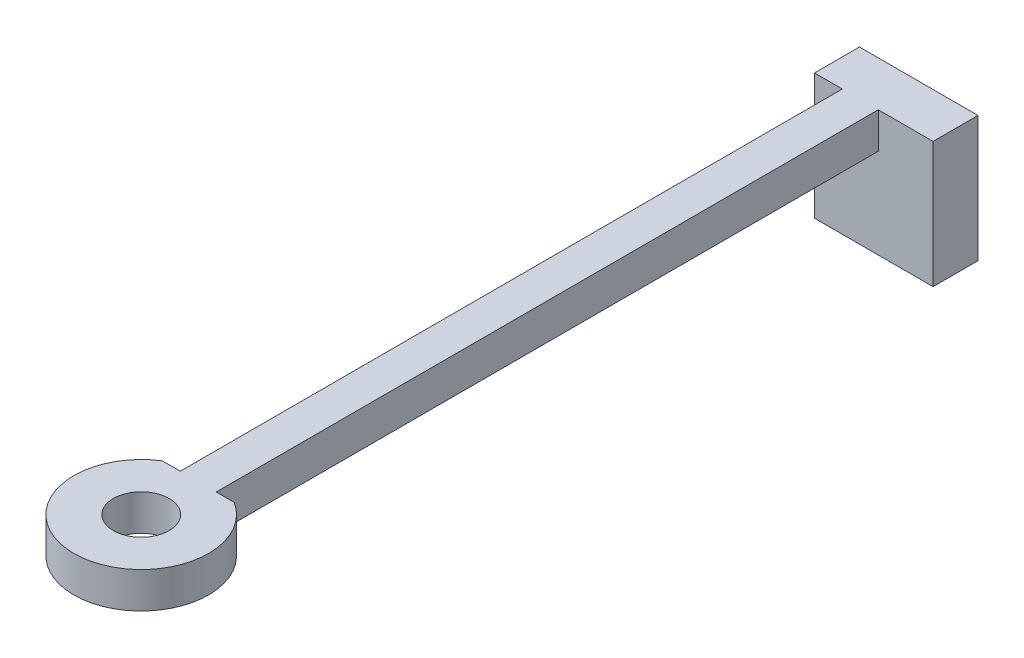
ISO-10303-21;
HEADER;
FILE_DESCRIPTION(('STEP AP214'),'2;1');
FILE_NAME('part.step','',(''),(''),'','','');
FILE_SCHEMA(('AUTOMOTIVE_DESIGN { 1 0 10303 214 1 1 1 1 }'));
ENDSEC;
DATA;
#1=APPLICATION_CONTEXT('core data for automotive mechanical design processes');
#2=APPLICATION_PROTOCOL_DEFINITION('international standard','automotive_design',2000,#1);
#3=PRODUCT_CONTEXT('',#1,'mechanical');
#4=PRODUCT('Part','Part','',(#3));
#5=PRODUCT_RELATED_PRODUCT_CATEGORY('part','',(#4));
#6=PRODUCT_DEFINITION_FORMATION('','',#4);
#7=PRODUCT_DEFINITION_CONTEXT('part definition',#1,'design');
#8=PRODUCT_DEFINITION('design','',#6,#7);
#9=PRODUCT_DEFINITION_SHAPE('','',#8);
#10=(LENGTH_UNIT() NAMED_UNIT(*) SI_UNIT(.MILLI.,.METRE.));
#11=(NAMED_UNIT(*) PLANE_ANGLE_UNIT() SI_UNIT($,.RADIAN.));
#12=(NAMED_UNIT(*) SI_UNIT($,.STERADIAN.) SOLID_ANGLE_UNIT());
#13=UNCERTAINTY_MEASURE_WITH_UNIT(LENGTH_MEASURE(1.E-05),#10,'distance_accuracy_value','');
#14=(GEOMETRIC_REPRESENTATION_CONTEXT(3) GLOBAL_UNCERTAINTY_ASSIGNED_CONTEXT((#13)) GLOBAL_UNIT_ASSIGNED_CONTEXT((#10,
#11,#12)) REPRESENTATION_CONTEXT('',''));
#15=CARTESIAN_POINT('',(0.,0.,0.));
#16=DIRECTION('',(0.,0.,1.));
#17=DIRECTION('',(1.,0.,0.));
#18=AXIS2_PLACEMENT_3D('',#15,#16,#17);
#19=CARTESIAN_POINT('',(0.,4.,0.));
#20=DIRECTION('',(0.,1.,0.));
#21=DIRECTION('',(0.,0.,1.));
#22=AXIS2_PLACEMENT_3D('',#19,#20,#21);
#23=PLANE('',#22);
#24=DIRECTION('',(0.,0.,1.));
#25=VECTOR('',#24,1.);
#26=CARTESIAN_POINT('',(1.99999999999998,4.,33.6557112297753));
#27=LINE('',#26,#25);
#28=CARTESIAN_POINT('',(1.99999999999998,4.,-39.9999999999999));
#29=VERTEX_POINT('',#28);
#30=CARTESIAN_POINT('',(1.99999999999998,4.,33.6557112297753));
#31=VERTEX_POINT('',#30);
#32=EDGE_CURVE('E183',#29,#31,#27,.T.);
#33=ORIENTED_EDGE('',*,*,#32,.F.);
#34=DIRECTION('',(-1.,0.,0.));
#35=VECTOR('',#34,1.);
#36=CARTESIAN_POINT('',(-5.0954148248011,4.,-40.));
#37=LINE('',#36,#35);
#38=CARTESIAN_POINT('',(8.09541482480107,4.,-40.));
#39=VERTEX_POINT('',#38);
#40=EDGE_CURVE('E155',#39,#29,#37,.T.);
#41=ORIENTED_EDGE('',*,*,#40,.F.);
#42=DIRECTION('',(0.,0.,1.));
#43=VECTOR('',#42,1.);
#44=CARTESIAN_POINT('',(8.09541482480107,4.,-40.));
#45=LINE('',#44,#43);
#46=CARTESIAN_POINT('',(8.09541482480107,4.,-45.));
#47=VERTEX_POINT('',#46);
#48=EDGE_CURVE('E131',#47,#39,#45,.T.);
#49=ORIENTED_EDGE('',*,*,#48,.F.);
#50=DIRECTION('',(-1.,0.,0.));
#51=VECTOR('',#50,1.);
#52=CARTESIAN_POINT('',(3.99999999999998,4.,-45.));
#53=LINE('',#52,#51);
#54=CARTESIAN_POINT('',(-5.0954148248011,4.,-45.));
#55=VERTEX_POINT('',#54);
#56=EDGE_CURVE('E213',#47,#55,#53,.T.);
#57=ORIENTED_EDGE('',*,*,#56,.T.);
#58=DIRECTION('',(0.,0.,-1.));
#59=VECTOR('',#58,1.);
#60=CARTESIAN_POINT('',(-5.0954148248011,4.,-40.));
#61=LINE('',#60,#59);
#62=CARTESIAN_POINT('',(-5.0954148248011,4.,-40.));
#63=VERTEX_POINT('',#62);
#64=EDGE_CURVE('E159',#63,#55,#61,.T.);
#65=ORIENTED_EDGE('',*,*,#64,.F.);
#66=CARTESIAN_POINT('',(-2.00000000000002,4.,-39.9999999999999));
#67=VERTEX_POINT('',#66);
#68=EDGE_CURVE('E154',#67,#63,#37,.T.);
#69=ORIENTED_EDGE('',*,*,#68,.F.);
#70=DIRECTION('',(0.,0.,-1.));
#71=VECTOR('',#70,1.);
#72=CARTESIAN_POINT('',(-2.00000000000002,4.,33.6557112297753));
#73=LINE('',#72,#71);
#74=CARTESIAN_POINT('',(-2.00000000000002,4.,33.6557112297753));
#75=VERTEX_POINT('',#74);
#76=EDGE_CURVE('E55',#75,#67,#73,.T.);
#77=ORIENTED_EDGE('',*,*,#76,.F.);
#78=DIRECTION('',(1.,0.,0.));
#79=VECTOR('',#78,1.);
#80=CARTESIAN_POINT('',(-4.00000000000002,4.,33.6557112297753));
#81=LINE('',#80,#79);
#82=CARTESIAN_POINT('',(-4.00000000000002,4.,33.6557112297753));
#83=VERTEX_POINT('',#82);
#84=EDGE_CURVE('E190',#83,#75,#81,.T.);
#85=ORIENTED_EDGE('',*,*,#84,.F.);
#86=CARTESIAN_POINT('',(0.,4.,40.));
#87=DIRECTION('',(0.,1.,0.));
#88=DIRECTION('',(0.,0.,1.));
#89=AXIS2_PLACEMENT_3D('',#86,#87,#88);
#90=CIRCLE('',#89,7.5);
#91=CARTESIAN_POINT('',(4.00000000000003,4.,33.6557112297753));
#92=VERTEX_POINT('',#91);
#93=EDGE_CURVE('E201',#83,#92,#90,.T.);
#94=ORIENTED_EDGE('',*,*,#93,.T.);
#95=DIRECTION('',(1.,0.,0.));
#96=VECTOR('',#95,1.);
#97=CARTESIAN_POINT('',(1.99999999999998,4.,33.6557112297753));
#98=LINE('',#97,#96);
#99=EDGE_CURVE('E178',#31,#92,#98,.T.);
#100=ORIENTED_EDGE('',*,*,#99,.F.);
#101=EDGE_LOOP('',(#33,#41,#49,#57,#65,#69,#77,#85,#94,#100));
#102=FACE_BOUND('',#101,.T.);
#103=CARTESIAN_POINT('',(0.,4.,40.));
#104=DIRECTION('',(0.,1.,0.));
#105=DIRECTION('',(0.,0.,1.));
#106=AXIS2_PLACEMENT_3D('',#103,#104,#105);
#107=CIRCLE('',#106,3.1);
#108=CARTESIAN_POINT('',(0.,4.,43.1));
#109=VERTEX_POINT('',#108);
#110=EDGE_CURVE('E210',#109,#109,#107,.T.);
#111=ORIENTED_EDGE('',*,*,#110,.F.);
#112=EDGE_LOOP('',(#111));
#113=FACE_BOUND('',#112,.T.);
#114=ADVANCED_FACE('F35',(#102,#113),#23,.T.);
#115=CARTESIAN_POINT('',(0.,0.,0.));
#116=DIRECTION('',(0.,1.,0.));
#117=DIRECTION('',(0.,0.,1.));
#118=AXIS2_PLACEMENT_3D('',#115,#116,#117);
#119=PLANE('',#118);
#120=DIRECTION('',(0.,0.,-1.));
#121=VECTOR('',#120,1.);
#122=CARTESIAN_POINT('',(-2.00000000000002,0.,33.6557112297753));
#123=LINE('',#122,#121);
#124=CARTESIAN_POINT('',(-2.00000000000002,0.,33.6557112297753));
#125=VERTEX_POINT('',#124);
#126=CARTESIAN_POINT('',(-2.00000000000002,0.,-39.9999999999999));
#127=VERTEX_POINT('',#126);
#128=EDGE_CURVE('E194',#125,#127,#123,.T.);
#129=ORIENTED_EDGE('',*,*,#128,.T.);
#130=DIRECTION('',(1.,0.,0.));
#131=VECTOR('',#130,1.);
#132=CARTESIAN_POINT('',(0.,0.,-40.));
#133=LINE('',#132,#131);
#134=CARTESIAN_POINT('',(-0.999999999999994,0.,-40.));
#135=VERTEX_POINT('',#134);
#136=EDGE_CURVE('E167',#127,#135,#133,.T.);
#137=ORIENTED_EDGE('',*,*,#136,.T.);
#138=DIRECTION('',(0.,0.,1.));
#139=VECTOR('',#138,1.);
#140=CARTESIAN_POINT('',(-0.999999999999986,0.,40.));
#141=LINE('',#140,#139);
#142=CARTESIAN_POINT('',(-0.99999999999999,0.,33.6557112297753));
#143=VERTEX_POINT('',#142);
#144=EDGE_CURVE('E176',#135,#143,#141,.T.);
#145=ORIENTED_EDGE('',*,*,#144,.T.);
#146=DIRECTION('',(1.,0.,0.));
#147=VECTOR('',#146,1.);
#148=CARTESIAN_POINT('',(0.,0.,33.6557112297753));
#149=LINE('',#148,#147);
#150=CARTESIAN_POINT('',(1.00000000000001,0.,33.6557112297753));
#151=VERTEX_POINT('',#150);
#152=EDGE_CURVE('E43',#143,#151,#149,.T.);
#153=ORIENTED_EDGE('',*,*,#152,.T.);
#154=DIRECTION('',(0.,0.,1.));
#155=VECTOR('',#154,1.);
#156=CARTESIAN_POINT('',(1.,0.,40.));
#157=LINE('',#156,#155);
#158=CARTESIAN_POINT('',(0.999999999999995,0.,-40.));
#159=VERTEX_POINT('',#158);
#160=EDGE_CURVE('E173',#151,#159,#157,.F.);
#161=ORIENTED_EDGE('',*,*,#160,.T.);
#162=CARTESIAN_POINT('',(1.99999999999998,0.,-39.9999999999999));
#163=VERTEX_POINT('',#162);
#164=EDGE_CURVE('E134',#159,#163,#133,.T.);
#165=ORIENTED_EDGE('',*,*,#164,.T.);
#166=DIRECTION('',(0.,0.,1.));
#167=VECTOR('',#166,1.);
#168=CARTESIAN_POINT('',(1.99999999999998,0.,33.6557112297753));
#169=LINE('',#168,#167);
#170=CARTESIAN_POINT('',(1.99999999999998,0.,33.6557112297753));
#171=VERTEX_POINT('',#170);
#172=EDGE_CURVE('E182',#163,#171,#169,.T.);
#173=ORIENTED_EDGE('',*,*,#172,.T.);
#174=DIRECTION('',(1.,0.,0.));
#175=VECTOR('',#174,1.);
#176=CARTESIAN_POINT('',(1.99999999999998,0.,33.6557112297753));
#177=LINE('',#176,#175);
#178=CARTESIAN_POINT('',(4.00000000000003,0.,33.6557112297753));
#179=VERTEX_POINT('',#178);
#180=EDGE_CURVE('E179',#171,#179,#177,.T.);
#181=ORIENTED_EDGE('',*,*,#180,.T.);
#182=CARTESIAN_POINT('',(0.,0.,40.));
#183=DIRECTION('',(0.,1.,0.));
#184=DIRECTION('',(0.,0.,1.));
#185=AXIS2_PLACEMENT_3D('',#182,#183,#184);
#186=CIRCLE('',#185,7.5);
#187=CARTESIAN_POINT('',(-4.00000000000002,0.,33.6557112297753));
#188=VERTEX_POINT('',#187);
#189=EDGE_CURVE('E202',#179,#188,#186,.F.);
#190=ORIENTED_EDGE('',*,*,#189,.T.);
#191=DIRECTION('',(1.,0.,0.));
#192=VECTOR('',#191,1.);
#193=CARTESIAN_POINT('',(-4.00000000000002,0.,33.6557112297753));
#194=LINE('',#193,#192);
#195=EDGE_CURVE('E191',#188,#125,#194,.T.);
#196=ORIENTED_EDGE('',*,*,#195,.T.);
#197=EDGE_LOOP('',(#129,#137,#145,#153,#161,#165,#173,#181,#190,#196));
#198=FACE_BOUND('',#197,.T.);
#199=CARTESIAN_POINT('',(0.,0.,40.));
#200=DIRECTION('',(0.,1.,0.));
#201=DIRECTION('',(0.,0.,1.));
#202=AXIS2_PLACEMENT_3D('',#199,#200,#201);
#203=CIRCLE('',#202,3.1);
#204=CARTESIAN_POINT('',(0.,0.,43.1));
#205=VERTEX_POINT('',#204);
#206=EDGE_CURVE('E209',#205,#205,#203,.T.);
#207=ORIENTED_EDGE('',*,*,#206,.T.);
#208=EDGE_LOOP('',(#207));
#209=FACE_BOUND('',#208,.T.);
#210=ADVANCED_FACE('F221',(#198,#209),#119,.F.);
#211=CARTESIAN_POINT('',(3.99999999999998,4.,-45.));
#212=DIRECTION('',(0.,0.,1.));
#213=DIRECTION('',(1.,0.,0.));
#214=AXIS2_PLACEMENT_3D('',#211,#212,#213);
#215=PLANE('',#214);
#216=DIRECTION('',(0.,-1.,0.));
#217=VECTOR('',#216,1.);
#218=CARTESIAN_POINT('',(-5.0954148248011,18.1066646250921,-45.));
#219=LINE('',#218,#217);
#220=CARTESIAN_POINT('',(-5.0954148248011,-10.,-45.));
#221=VERTEX_POINT('',#220);
#222=EDGE_CURVE('E162',#55,#221,#219,.T.);
#223=ORIENTED_EDGE('',*,*,#222,.F.);
#224=ORIENTED_EDGE('',*,*,#56,.F.);
#225=DIRECTION('',(0.,-1.,0.));
#226=VECTOR('',#225,1.);
#227=CARTESIAN_POINT('',(8.09541482480107,18.1066646250921,-45.));
#228=LINE('',#227,#226);
#229=CARTESIAN_POINT('',(8.09541482480107,-10.,-45.));
#230=VERTEX_POINT('',#229);
#231=EDGE_CURVE('E158',#47,#230,#228,.T.);
#232=ORIENTED_EDGE('',*,*,#231,.T.);
#233=DIRECTION('',(1.,0.,0.));
#234=VECTOR('',#233,1.);
#235=CARTESIAN_POINT('',(-5.0954148248011,-10.,-45.));
#236=LINE('',#235,#234);
#237=EDGE_CURVE('E149',#221,#230,#236,.T.);
#238=ORIENTED_EDGE('',*,*,#237,.F.);
#239=EDGE_LOOP('',(#223,#224,#232,#238));
#240=FACE_BOUND('',#239,.T.);
#241=ADVANCED_FACE('F37',(#240),#215,.F.);
#242=CARTESIAN_POINT('',(0.,4.,40.));
#243=DIRECTION('',(0.,-1.,0.));
#244=DIRECTION('',(0.,0.,-1.));
#245=AXIS2_PLACEMENT_3D('',#242,#243,#244);
#246=CYLINDRICAL_SURFACE('',#245,3.1);
#247=ORIENTED_EDGE('',*,*,#110,.T.);
#248=EDGE_LOOP('',(#247));
#249=FACE_BOUND('',#248,.T.);
#250=ORIENTED_EDGE('',*,*,#206,.F.);
#251=EDGE_LOOP('',(#250));
#252=FACE_BOUND('',#251,.T.);
#253=ADVANCED_FACE('F260',(#249,#252),#246,.F.);
#254=CARTESIAN_POINT('',(0.,-21.2132034355964,40.));
#255=DIRECTION('',(0.,1.,0.));
#256=DIRECTION('',(0.,0.,1.));
#257=AXIS2_PLACEMENT_3D('',#254,#255,#256);
#258=CYLINDRICAL_SURFACE('',#257,7.5);
#259=DIRECTION('',(0.,1.,0.));
#260=VECTOR('',#259,1.);
#261=CARTESIAN_POINT('',(-4.00000000000002,-21.2132034355964,33.6557112297753));
#262=LINE('',#261,#260);
#263=EDGE_CURVE('E205',#188,#83,#262,.T.);
#264=ORIENTED_EDGE('',*,*,#263,.F.);
#265=ORIENTED_EDGE('',*,*,#189,.F.);
#266=DIRECTION('',(0.,1.,0.));
#267=VECTOR('',#266,1.);
#268=CARTESIAN_POINT('',(4.00000000000003,-21.2132034355964,33.6557112297753));
#269=LINE('',#268,#267);
#270=EDGE_CURVE('E217',#92,#179,#269,.F.);
#271=ORIENTED_EDGE('',*,*,#270,.F.);
#272=ORIENTED_EDGE('',*,*,#93,.F.);
#273=EDGE_LOOP('',(#264,#265,#271,#272));
#274=FACE_BOUND('',#273,.T.);
#275=ADVANCED_FACE('F246',(#274),#258,.T.);
#276=CARTESIAN_POINT('',(-2.00000000000002,0.,33.6557112297753));
#277=DIRECTION('',(1.,0.,0.));
#278=DIRECTION('',(0.,0.,-1.));
#279=AXIS2_PLACEMENT_3D('',#276,#277,#278);
#280=PLANE('',#279);
#281=ORIENTED_EDGE('',*,*,#76,.T.);
#282=DIRECTION('',(0.,-1.,0.));
#283=VECTOR('',#282,1.);
#284=CARTESIAN_POINT('',(-2.00000000000002,0.,-40.));
#285=LINE('',#284,#283);
#286=EDGE_CURVE('E50',#67,#127,#285,.T.);
#287=ORIENTED_EDGE('',*,*,#286,.T.);
#288=ORIENTED_EDGE('',*,*,#128,.F.);
#289=DIRECTION('',(0.,1.,0.));
#290=VECTOR('',#289,1.);
#291=CARTESIAN_POINT('',(-2.00000000000002,0.,33.6557112297753));
#292=LINE('',#291,#290);
#293=EDGE_CURVE('E196',#125,#75,#292,.T.);
#294=ORIENTED_EDGE('',*,*,#293,.T.);
#295=EDGE_LOOP('',(#281,#287,#288,#294));
#296=FACE_BOUND('',#295,.T.);
#297=ADVANCED_FACE('F274',(#296),#280,.F.);
#298=CARTESIAN_POINT('',(-4.00000000000002,0.,33.6557112297753));
#299=DIRECTION('',(0.,0.,1.));
#300=DIRECTION('',(1.,0.,0.));
#301=AXIS2_PLACEMENT_3D('',#298,#299,#300);
#302=PLANE('',#301);
#303=ORIENTED_EDGE('',*,*,#84,.T.);
#304=ORIENTED_EDGE('',*,*,#293,.F.);
#305=ORIENTED_EDGE('',*,*,#195,.F.);
#306=ORIENTED_EDGE('',*,*,#263,.T.);
#307=EDGE_LOOP('',(#303,#304,#305,#306));
#308=FACE_BOUND('',#307,.T.);
#309=ADVANCED_FACE('F250',(#308),#302,.F.);
#310=CARTESIAN_POINT('',(1.99999999999998,0.,33.6557112297753));
#311=DIRECTION('',(0.,0.,1.));
#312=DIRECTION('',(1.,0.,0.));
#313=AXIS2_PLACEMENT_3D('',#310,#311,#312);
#314=PLANE('',#313);
#315=ORIENTED_EDGE('',*,*,#99,.T.);
#316=ORIENTED_EDGE('',*,*,#270,.T.);
#317=ORIENTED_EDGE('',*,*,#180,.F.);
#318=DIRECTION('',(0.,1.,0.));
#319=VECTOR('',#318,1.);
#320=CARTESIAN_POINT('',(1.99999999999998,0.,33.6557112297753));
#321=LINE('',#320,#319);
#322=EDGE_CURVE('E185',#171,#31,#321,.T.);
#323=ORIENTED_EDGE('',*,*,#322,.T.);
#324=EDGE_LOOP('',(#315,#316,#317,#323));
#325=FACE_BOUND('',#324,.T.);
#326=ADVANCED_FACE('F241',(#325),#314,.F.);
#327=CARTESIAN_POINT('',(1.99999999999998,0.,33.6557112297753));
#328=DIRECTION('',(-1.,0.,0.));
#329=DIRECTION('',(0.,0.,1.));
#330=AXIS2_PLACEMENT_3D('',#327,#328,#329);
#331=PLANE('',#330);
#332=ORIENTED_EDGE('',*,*,#172,.F.);
#333=DIRECTION('',(0.,1.,0.));
#334=VECTOR('',#333,1.);
#335=CARTESIAN_POINT('',(1.99999999999998,0.,-40.));
#336=LINE('',#335,#334);
#337=EDGE_CURVE('E168',#163,#29,#336,.T.);
#338=ORIENTED_EDGE('',*,*,#337,.T.);
#339=ORIENTED_EDGE('',*,*,#32,.T.);
#340=ORIENTED_EDGE('',*,*,#322,.F.);
#341=EDGE_LOOP('',(#332,#338,#339,#340));
#342=FACE_BOUND('',#341,.T.);
#343=ADVANCED_FACE('F236',(#342),#331,.F.);
#344=CARTESIAN_POINT('',(-0.99999999999999,0.,33.6557112297753));
#345=DIRECTION('',(0.,0.,1.));
#346=DIRECTION('',(1.,0.,0.));
#347=AXIS2_PLACEMENT_3D('',#344,#345,#346);
#348=PLANE('',#347);
#349=ORIENTED_EDGE('',*,*,#152,.F.);
#350=CARTESIAN_POINT('',(0.,0.,33.6557112297753));
#351=DIRECTION('',(0.,0.,1.));
#352=DIRECTION('',(1.,0.,0.));
#353=AXIS2_PLACEMENT_3D('',#350,#351,#352);
#354=CIRCLE('',#353,0.999999999999999);
#355=EDGE_CURVE('E171',#143,#151,#354,.T.);
#356=ORIENTED_EDGE('',*,*,#355,.T.);
#357=EDGE_LOOP('',(#349,#356));
#358=FACE_BOUND('',#357,.T.);
#359=ADVANCED_FACE('F228',(#358),#348,.T.);
#360=CARTESIAN_POINT('',(0.,0.,40.));
#361=DIRECTION('',(0.,0.,1.));
#362=DIRECTION('',(1.,0.,0.));
#363=AXIS2_PLACEMENT_3D('',#360,#361,#362);
#364=CYLINDRICAL_SURFACE('',#363,0.999999999999995);
#365=CARTESIAN_POINT('',(0.,0.,-40.));
#366=DIRECTION('',(0.,0.,1.));
#367=DIRECTION('',(1.,0.,0.));
#368=AXIS2_PLACEMENT_3D('',#365,#366,#367);
#369=CIRCLE('',#368,0.999999999999995);
#370=EDGE_CURVE('E11',#159,#135,#369,.F.);
#371=ORIENTED_EDGE('',*,*,#370,.F.);
#372=ORIENTED_EDGE('',*,*,#160,.F.);
#373=ORIENTED_EDGE('',*,*,#355,.F.);
#374=ORIENTED_EDGE('',*,*,#144,.F.);
#375=EDGE_LOOP('',(#371,#372,#373,#374));
#376=FACE_BOUND('',#375,.T.);
#377=ADVANCED_FACE('F230',(#376),#364,.T.);
#378=CARTESIAN_POINT('',(-5.0954148248011,18.1066646250921,-40.));
#379=DIRECTION('',(0.,0.,1.));
#380=DIRECTION('',(1.,0.,0.));
#381=AXIS2_PLACEMENT_3D('',#378,#379,#380);
#382=PLANE('',#381);
#383=ORIENTED_EDGE('',*,*,#286,.F.);
#384=ORIENTED_EDGE('',*,*,#68,.T.);
#385=DIRECTION('',(0.,-1.,0.));
#386=VECTOR('',#385,1.);
#387=CARTESIAN_POINT('',(-5.0954148248011,18.1066646250921,-40.));
#388=LINE('',#387,#386);
#389=CARTESIAN_POINT('',(-5.0954148248011,-10.,-40.));
#390=VERTEX_POINT('',#389);
#391=EDGE_CURVE('E140',#63,#390,#388,.T.);
#392=ORIENTED_EDGE('',*,*,#391,.T.);
#393=DIRECTION('',(-1.,0.,0.));
#394=VECTOR('',#393,1.);
#395=CARTESIAN_POINT('',(-5.0954148248011,-10.,-40.));
#396=LINE('',#395,#394);
#397=CARTESIAN_POINT('',(8.09541482480107,-10.,-40.));
#398=VERTEX_POINT('',#397);
#399=EDGE_CURVE('E137',#398,#390,#396,.T.);
#400=ORIENTED_EDGE('',*,*,#399,.F.);
#401=DIRECTION('',(0.,-1.,0.));
#402=VECTOR('',#401,1.);
#403=CARTESIAN_POINT('',(8.09541482480107,18.1066646250921,-40.));
#404=LINE('',#403,#402);
#405=EDGE_CURVE('E124',#39,#398,#404,.T.);
#406=ORIENTED_EDGE('',*,*,#405,.F.);
#407=ORIENTED_EDGE('',*,*,#40,.T.);
#408=ORIENTED_EDGE('',*,*,#337,.F.);
#409=ORIENTED_EDGE('',*,*,#164,.F.);
#410=ORIENTED_EDGE('',*,*,#370,.T.);
#411=ORIENTED_EDGE('',*,*,#136,.F.);
#412=EDGE_LOOP('',(#383,#384,#392,#400,#406,#407,#408,#409,#410,#411));
#413=FACE_BOUND('',#412,.T.);
#414=ADVANCED_FACE('F138',(#413),#382,.T.);
#415=CARTESIAN_POINT('',(-5.0954148248011,18.1066646250921,-40.));
#416=DIRECTION('',(-1.,0.,0.));
#417=DIRECTION('',(0.,0.,1.));
#418=AXIS2_PLACEMENT_3D('',#415,#416,#417);
#419=PLANE('',#418);
#420=ORIENTED_EDGE('',*,*,#391,.F.);
#421=ORIENTED_EDGE('',*,*,#64,.T.);
#422=ORIENTED_EDGE('',*,*,#222,.T.);
#423=DIRECTION('',(0.,0.,-1.));
#424=VECTOR('',#423,1.);
#425=CARTESIAN_POINT('',(-5.0954148248011,-10.,-40.));
#426=LINE('',#425,#424);
#427=EDGE_CURVE('E144',#390,#221,#426,.T.);
#428=ORIENTED_EDGE('',*,*,#427,.F.);
#429=EDGE_LOOP('',(#420,#421,#422,#428));
#430=FACE_BOUND('',#429,.T.);
#431=ADVANCED_FACE('F257',(#430),#419,.T.);
#432=CARTESIAN_POINT('',(8.09541482480107,18.1066646250921,-40.));
#433=DIRECTION('',(1.,0.,0.));
#434=DIRECTION('',(0.,0.,-1.));
#435=AXIS2_PLACEMENT_3D('',#432,#433,#434);
#436=PLANE('',#435);
#437=ORIENTED_EDGE('',*,*,#231,.F.);
#438=ORIENTED_EDGE('',*,*,#48,.T.);
#439=ORIENTED_EDGE('',*,*,#405,.T.);
#440=DIRECTION('',(0.,0.,1.));
#441=VECTOR('',#440,1.);
#442=CARTESIAN_POINT('',(8.09541482480107,-10.,-40.));
#443=LINE('',#442,#441);
#444=EDGE_CURVE('E129',#230,#398,#443,.T.);
#445=ORIENTED_EDGE('',*,*,#444,.F.);
#446=EDGE_LOOP('',(#437,#438,#439,#445));
#447=FACE_BOUND('',#446,.T.);
#448=ADVANCED_FACE('F127',(#447),#436,.T.);
#449=CARTESIAN_POINT('',(0.,-10.,0.));
#450=DIRECTION('',(0.,-1.,0.));
#451=DIRECTION('',(0.,0.,-1.));
#452=AXIS2_PLACEMENT_3D('',#449,#450,#451);
#453=PLANE('',#452);
#454=ORIENTED_EDGE('',*,*,#444,.T.);
#455=ORIENTED_EDGE('',*,*,#399,.T.);
#456=ORIENTED_EDGE('',*,*,#427,.T.);
#457=ORIENTED_EDGE('',*,*,#237,.T.);
#458=EDGE_LOOP('',(#454,#455,#456,#457));
#459=FACE_BOUND('',#458,.T.);
#460=ADVANCED_FACE('F147',(#459),#453,.T.);
#461=CLOSED_SHELL('',(#114,#210,#241,#253,#275,#297,#309,#326,#343,#359,#377,#414,#431,#448,#460));
#462=MANIFOLD_SOLID_BREP('B2',#461);
#463=ADVANCED_BREP_SHAPE_REPRESENTATION('',(#18,#462),#14);
#464=SHAPE_DEFINITION_REPRESENTATION(#9,#463);
ENDSEC;
END-ISO-10303-21;
